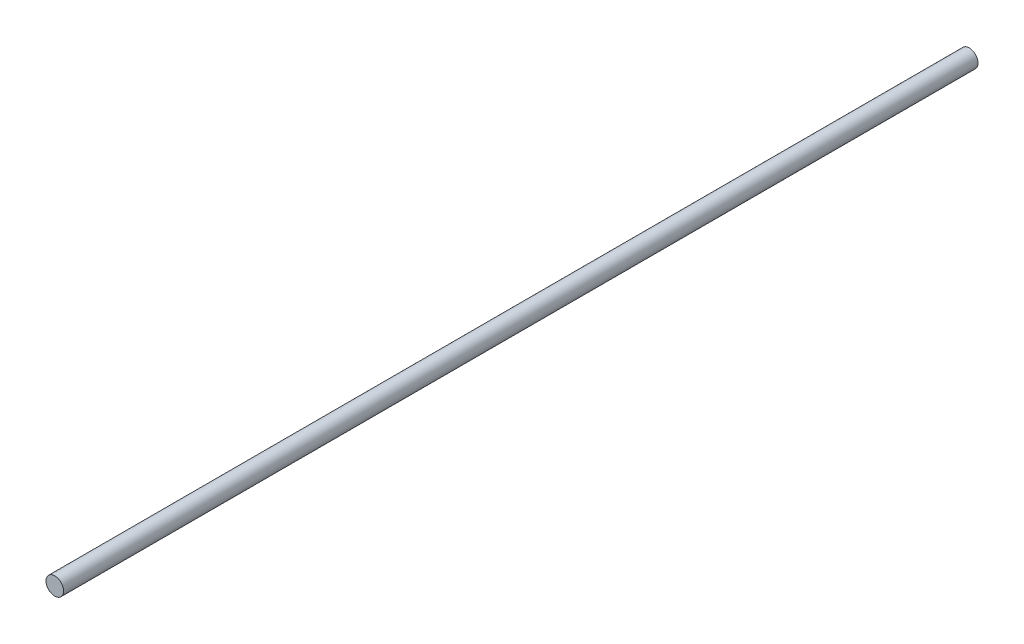
ISO-10303-21;
HEADER;
FILE_DESCRIPTION(('STEP AP214'),'2;1');
FILE_NAME('part.step','',(''),(''),'','','');
FILE_SCHEMA(('AUTOMOTIVE_DESIGN { 1 0 10303 214 1 1 1 1 }'));
ENDSEC;
DATA;
#1=APPLICATION_CONTEXT('core data for automotive mechanical design processes');
#2=APPLICATION_PROTOCOL_DEFINITION('international standard','automotive_design',2000,#1);
#3=PRODUCT_CONTEXT('',#1,'mechanical');
#4=PRODUCT('Part','Part','',(#3));
#5=PRODUCT_RELATED_PRODUCT_CATEGORY('part','',(#4));
#6=PRODUCT_DEFINITION_FORMATION('','',#4);
#7=PRODUCT_DEFINITION_CONTEXT('part definition',#1,'design');
#8=PRODUCT_DEFINITION('design','',#6,#7);
#9=PRODUCT_DEFINITION_SHAPE('','',#8);
#10=(LENGTH_UNIT() NAMED_UNIT(*) SI_UNIT(.MILLI.,.METRE.));
#11=(NAMED_UNIT(*) PLANE_ANGLE_UNIT() SI_UNIT($,.RADIAN.));
#12=(NAMED_UNIT(*) SI_UNIT($,.STERADIAN.) SOLID_ANGLE_UNIT());
#13=UNCERTAINTY_MEASURE_WITH_UNIT(LENGTH_MEASURE(1.E-05),#10,'distance_accuracy_value','');
#14=(GEOMETRIC_REPRESENTATION_CONTEXT(3) GLOBAL_UNCERTAINTY_ASSIGNED_CONTEXT((#13)) GLOBAL_UNIT_ASSIGNED_CONTEXT((#10,
#11,#12)) REPRESENTATION_CONTEXT('',''));
#15=CARTESIAN_POINT('',(0.,0.,0.));
#16=DIRECTION('',(0.,0.,1.));
#17=DIRECTION('',(1.,0.,0.));
#18=AXIS2_PLACEMENT_3D('',#15,#16,#17);
#19=CARTESIAN_POINT('',(0.,0.,416.));
#20=DIRECTION('',(0.,0.,-1.));
#21=DIRECTION('',(-1.,0.,0.));
#22=AXIS2_PLACEMENT_3D('',#19,#20,#21);
#23=CYLINDRICAL_SURFACE('',#22,4.);
#24=CARTESIAN_POINT('',(0.,0.,416.));
#25=DIRECTION('',(0.,0.,1.));
#26=DIRECTION('',(1.,0.,0.));
#27=AXIS2_PLACEMENT_3D('',#24,#25,#26);
#28=CIRCLE('',#27,4.);
#29=CARTESIAN_POINT('',(-4.,0.,416.));
#30=VERTEX_POINT('',#29);
#31=EDGE_CURVE('E10',#30,#30,#28,.T.);
#32=CARTESIAN_POINT('',(0.,0.,0.));
#33=DIRECTION('',(0.,0.,1.));
#34=DIRECTION('',(1.,0.,0.));
#35=AXIS2_PLACEMENT_3D('',#32,#33,#34);
#36=CIRCLE('',#35,4.);
#37=CARTESIAN_POINT('',(-4.,0.,0.));
#38=VERTEX_POINT('',#37);
#39=EDGE_CURVE('E40',#38,#38,#36,.T.);
#40=CARTESIAN_POINT('',(-4.,0.,416.));
#41=CARTESIAN_POINT('',(-4.,0.,411.666666666667));
#42=CARTESIAN_POINT('',(-4.,0.,407.333333333333));
#43=CARTESIAN_POINT('',(-4.,0.,398.666666666667));
#44=CARTESIAN_POINT('',(-4.,0.,394.333333333333));
#45=CARTESIAN_POINT('',(-4.,0.,385.666666666667));
#46=CARTESIAN_POINT('',(-4.,0.,381.333333333333));
#47=CARTESIAN_POINT('',(-4.,0.,372.666666666667));
#48=CARTESIAN_POINT('',(-4.,0.,368.333333333333));
#49=CARTESIAN_POINT('',(-4.,0.,359.666666666667));
#50=CARTESIAN_POINT('',(-4.,0.,355.333333333333));
#51=CARTESIAN_POINT('',(-4.,0.,346.666666666667));
#52=CARTESIAN_POINT('',(-4.,0.,342.333333333333));
#53=CARTESIAN_POINT('',(-4.,0.,333.666666666667));
#54=CARTESIAN_POINT('',(-4.,0.,329.333333333333));
#55=CARTESIAN_POINT('',(-4.,0.,320.666666666667));
#56=CARTESIAN_POINT('',(-4.,0.,316.333333333333));
#57=CARTESIAN_POINT('',(-4.,0.,307.666666666667));
#58=CARTESIAN_POINT('',(-4.,0.,303.333333333333));
#59=CARTESIAN_POINT('',(-4.,0.,294.666666666667));
#60=CARTESIAN_POINT('',(-4.,0.,290.333333333333));
#61=CARTESIAN_POINT('',(-4.,0.,281.666666666667));
#62=CARTESIAN_POINT('',(-4.,0.,277.333333333333));
#63=CARTESIAN_POINT('',(-4.,0.,268.666666666667));
#64=CARTESIAN_POINT('',(-4.,0.,264.333333333333));
#65=CARTESIAN_POINT('',(-4.,0.,255.666666666667));
#66=CARTESIAN_POINT('',(-4.,0.,251.333333333333));
#67=CARTESIAN_POINT('',(-4.,0.,242.666666666667));
#68=CARTESIAN_POINT('',(-4.,0.,238.333333333333));
#69=CARTESIAN_POINT('',(-4.,0.,229.666666666667));
#70=CARTESIAN_POINT('',(-4.,0.,225.333333333333));
#71=CARTESIAN_POINT('',(-4.,0.,216.666666666667));
#72=CARTESIAN_POINT('',(-4.,0.,212.333333333333));
#73=CARTESIAN_POINT('',(-4.,0.,203.666666666667));
#74=CARTESIAN_POINT('',(-4.,0.,199.333333333333));
#75=CARTESIAN_POINT('',(-4.,0.,190.666666666667));
#76=CARTESIAN_POINT('',(-4.,0.,186.333333333333));
#77=CARTESIAN_POINT('',(-4.,0.,177.666666666667));
#78=CARTESIAN_POINT('',(-4.,0.,173.333333333333));
#79=CARTESIAN_POINT('',(-4.,0.,164.666666666667));
#80=CARTESIAN_POINT('',(-4.,0.,160.333333333333));
#81=CARTESIAN_POINT('',(-4.,0.,151.666666666667));
#82=CARTESIAN_POINT('',(-4.,0.,147.333333333333));
#83=CARTESIAN_POINT('',(-4.,0.,138.666666666667));
#84=CARTESIAN_POINT('',(-4.,0.,134.333333333333));
#85=CARTESIAN_POINT('',(-4.,0.,125.666666666667));
#86=CARTESIAN_POINT('',(-4.,0.,121.333333333333));
#87=CARTESIAN_POINT('',(-4.,0.,112.666666666667));
#88=CARTESIAN_POINT('',(-4.,0.,108.333333333333));
#89=CARTESIAN_POINT('',(-4.,0.,99.6666666666667));
#90=CARTESIAN_POINT('',(-4.,0.,95.3333333333333));
#91=CARTESIAN_POINT('',(-4.,0.,86.6666666666667));
#92=CARTESIAN_POINT('',(-4.,0.,82.3333333333334));
#93=CARTESIAN_POINT('',(-4.,0.,73.6666666666667));
#94=CARTESIAN_POINT('',(-4.,0.,69.3333333333333));
#95=CARTESIAN_POINT('',(-4.,0.,60.6666666666667));
#96=CARTESIAN_POINT('',(-4.,0.,56.3333333333333));
#97=CARTESIAN_POINT('',(-4.,0.,47.6666666666667));
#98=CARTESIAN_POINT('',(-4.,0.,43.3333333333333));
#99=CARTESIAN_POINT('',(-4.,0.,34.6666666666667));
#100=CARTESIAN_POINT('',(-4.,0.,30.3333333333333));
#101=CARTESIAN_POINT('',(-4.,0.,21.6666666666667));
#102=CARTESIAN_POINT('',(-4.,0.,17.3333333333333));
#103=CARTESIAN_POINT('',(-4.,0.,8.66666666666668));
#104=CARTESIAN_POINT('',(-4.,0.,4.33333333333334));
#105=CARTESIAN_POINT('',(-4.,0.,0.));
#106=B_SPLINE_CURVE_WITH_KNOTS('',3,(#40,#41,#42,#43,#44,#45,#46,#47,#48,#49,#50,#51,#52,#53,
#54,#55,#56,#57,#58,#59,#60,#61,#62,#63,#64,#65,#66,#67,#68,#69,#70,#71,#72,#73,#74,#75,#76,#77,
#78,#79,#80,#81,#82,#83,#84,#85,#86,#87,#88,#89,#90,#91,#92,#93,#94,#95,#96,#97,#98,#99,#100,
#101,#102,#103,#104,#105),.UNSPECIFIED.,.F.,.F.,(4,2,2,2,2,2,2,2,2,2,2,2,2,2,2,2,2,2,2,2,2,2,2,
2,2,2,2,2,2,2,2,2,4),(0.,13.,26.,39.,52.,65.,78.,91.,104.,117.,130.,143.,156.,169.,182.,195.,
208.,221.,234.,247.,260.,273.,286.,299.,312.,325.,338.,351.,364.,377.,390.,403.,416.),.UNSPECIFIED.);
#107=EDGE_CURVE('BSEAM37',#30,#38,#106,.T.);
#108=ORIENTED_EDGE('',*,*,#31,.F.);
#109=ORIENTED_EDGE('',*,*,#39,.T.);
#110=ORIENTED_EDGE('',*,*,#107,.T.);
#111=ORIENTED_EDGE('',*,*,#107,.F.);
#112=EDGE_LOOP('',(#108,#110,#109,#111));
#113=FACE_BOUND('',#112,.T.);
#114=ADVANCED_FACE('F37',(#113),#23,.T.);
#115=CARTESIAN_POINT('',(0.,0.,416.));
#116=DIRECTION('',(0.,0.,1.));
#117=DIRECTION('',(1.,0.,0.));
#118=AXIS2_PLACEMENT_3D('',#115,#116,#117);
#119=PLANE('',#118);
#120=ORIENTED_EDGE('',*,*,#31,.T.);
#121=EDGE_LOOP('',(#120));
#122=FACE_BOUND('',#121,.T.);
#123=ADVANCED_FACE('F54',(#122),#119,.T.);
#124=CARTESIAN_POINT('',(0.,0.,0.));
#125=DIRECTION('',(0.,0.,1.));
#126=DIRECTION('',(1.,0.,0.));
#127=AXIS2_PLACEMENT_3D('',#124,#125,#126);
#128=PLANE('',#127);
#129=ORIENTED_EDGE('',*,*,#39,.F.);
#130=EDGE_LOOP('',(#129));
#131=FACE_BOUND('',#130,.T.);
#132=ADVANCED_FACE('F52',(#131),#128,.F.);
#133=CLOSED_SHELL('',(#114,#123,#132));
#134=MANIFOLD_SOLID_BREP('B2',#133);
#135=ADVANCED_BREP_SHAPE_REPRESENTATION('',(#18,#134),#14);
#136=SHAPE_DEFINITION_REPRESENTATION(#9,#135);
ENDSEC;
END-ISO-10303-21;
